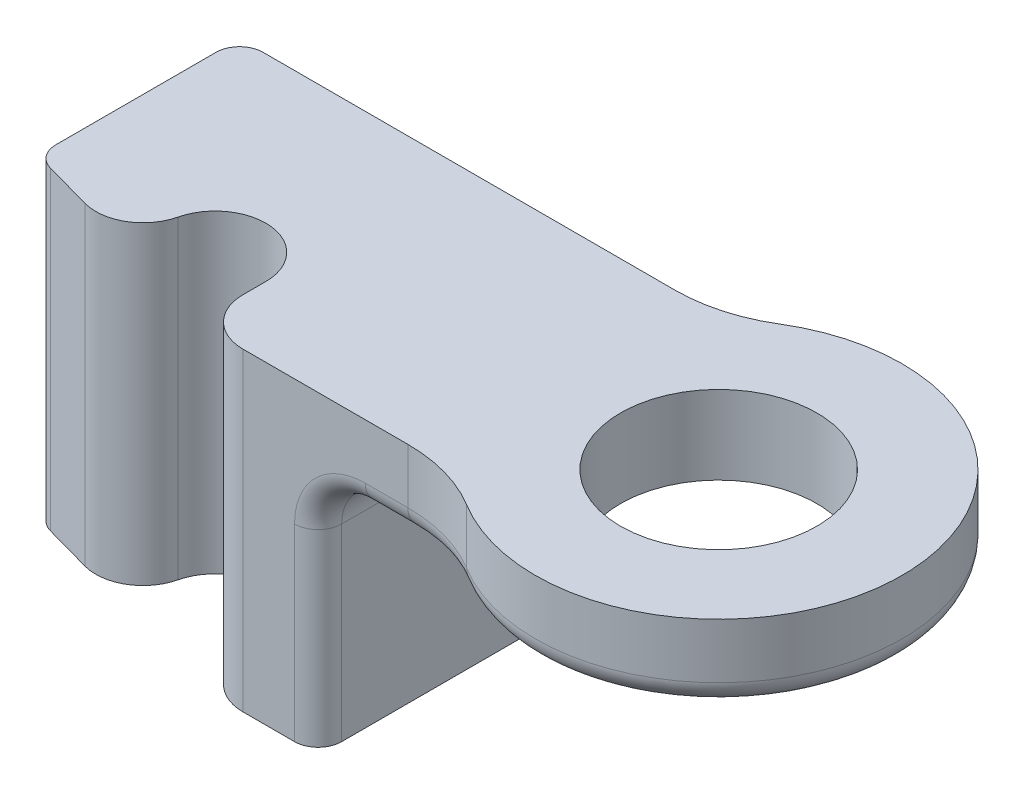
ISO-10303-21;
HEADER;
FILE_DESCRIPTION(('STEP AP214'),'2;1');
FILE_NAME('part.step','',(''),(''),'','','');
FILE_SCHEMA(('AUTOMOTIVE_DESIGN { 1 0 10303 214 1 1 1 1 }'));
ENDSEC;
DATA;
#1=APPLICATION_CONTEXT('core data for automotive mechanical design processes');
#2=APPLICATION_PROTOCOL_DEFINITION('international standard','automotive_design',2000,#1);
#3=PRODUCT_CONTEXT('',#1,'mechanical');
#4=PRODUCT('Part','Part','',(#3));
#5=PRODUCT_RELATED_PRODUCT_CATEGORY('part','',(#4));
#6=PRODUCT_DEFINITION_FORMATION('','',#4);
#7=PRODUCT_DEFINITION_CONTEXT('part definition',#1,'design');
#8=PRODUCT_DEFINITION('design','',#6,#7);
#9=PRODUCT_DEFINITION_SHAPE('','',#8);
#10=(LENGTH_UNIT() NAMED_UNIT(*) SI_UNIT(.MILLI.,.METRE.));
#11=(NAMED_UNIT(*) PLANE_ANGLE_UNIT() SI_UNIT($,.RADIAN.));
#12=(NAMED_UNIT(*) SI_UNIT($,.STERADIAN.) SOLID_ANGLE_UNIT());
#13=UNCERTAINTY_MEASURE_WITH_UNIT(LENGTH_MEASURE(1.E-05),#10,'distance_accuracy_value','');
#14=(GEOMETRIC_REPRESENTATION_CONTEXT(3) GLOBAL_UNCERTAINTY_ASSIGNED_CONTEXT((#13)) GLOBAL_UNIT_ASSIGNED_CONTEXT((#10,
#11,#12)) REPRESENTATION_CONTEXT('',''));
#15=CARTESIAN_POINT('',(0.,0.,0.));
#16=DIRECTION('',(0.,0.,1.));
#17=DIRECTION('',(1.,0.,0.));
#18=AXIS2_PLACEMENT_3D('',#15,#16,#17);
#19=CARTESIAN_POINT('',(0.,40.,0.));
#20=DIRECTION('',(0.,1.,0.));
#21=DIRECTION('',(0.,0.,1.));
#22=AXIS2_PLACEMENT_3D('',#19,#20,#21);
#23=PLANE('',#22);
#24=CARTESIAN_POINT('',(-0.249999999999992,40.,34.2936409579055));
#25=DIRECTION('',(0.,1.,0.));
#26=DIRECTION('',(0.,0.,1.));
#27=AXIS2_PLACEMENT_3D('',#24,#25,#26);
#28=CIRCLE('',#27,6.25);
#29=CARTESIAN_POINT('',(-0.249999999999992,40.,40.5436409579055));
#30=VERTEX_POINT('',#29);
#31=EDGE_CURVE('E193',#30,#30,#28,.T.);
#32=ORIENTED_EDGE('',*,*,#31,.F.);
#33=EDGE_LOOP('',(#32));
#34=FACE_BOUND('',#33,.T.);
#35=DIRECTION('',(0.,0.,1.));
#36=VECTOR('',#35,1.);
#37=CARTESIAN_POINT('',(-25.0293818679506,40.,0.));
#38=LINE('',#37,#36);
#39=CARTESIAN_POINT('',(-25.0293818679506,40.,38.3421713908331));
#40=VERTEX_POINT('',#39);
#41=CARTESIAN_POINT('',(-25.0293818679506,40.,39.7936409579055));
#42=VERTEX_POINT('',#41);
#43=EDGE_CURVE('E189',#40,#42,#38,.T.);
#44=ORIENTED_EDGE('',*,*,#43,.T.);
#45=CARTESIAN_POINT('',(-22.0293818679506,40.,39.7936409579055));
#46=DIRECTION('',(0.,1.,0.));
#47=DIRECTION('',(0.,0.,1.));
#48=AXIS2_PLACEMENT_3D('',#45,#46,#47);
#49=CIRCLE('',#48,3.);
#50=CARTESIAN_POINT('',(-22.0293818679506,40.,42.7936409579055));
#51=VERTEX_POINT('',#50);
#52=EDGE_CURVE('E284',#42,#51,#49,.T.);
#53=ORIENTED_EDGE('',*,*,#52,.T.);
#54=DIRECTION('',(1.,0.,0.));
#55=VECTOR('',#54,1.);
#56=CARTESIAN_POINT('',(0.,40.,42.7936409579055));
#57=LINE('',#56,#55);
#58=CARTESIAN_POINT('',(-11.5394796425068,40.,42.7936409579055));
#59=VERTEX_POINT('',#58);
#60=EDGE_CURVE('E251',#51,#59,#57,.T.);
#61=ORIENTED_EDGE('',*,*,#60,.T.);
#62=CARTESIAN_POINT('',(-11.5394796425068,40.,52.7936409579055));
#63=DIRECTION('',(0.,1.,0.));
#64=DIRECTION('',(0.,0.,1.));
#65=AXIS2_PLACEMENT_3D('',#62,#63,#64);
#66=CIRCLE('',#65,10.);
#67=CARTESIAN_POINT('',(-6.33038128282936,40.,44.2575239086139));
#68=VERTEX_POINT('',#67);
#69=EDGE_CURVE('E298',#59,#68,#66,.F.);
#70=ORIENTED_EDGE('',*,*,#69,.T.);
#71=CARTESIAN_POINT('',(-0.249999999999992,40.,34.2936409579055));
#72=DIRECTION('',(0.,1.,0.));
#73=DIRECTION('',(0.,0.,1.));
#74=AXIS2_PLACEMENT_3D('',#71,#72,#73);
#75=CIRCLE('',#74,11.6726175299288);
#76=CARTESIAN_POINT('',(-6.33038128282937,40.,24.329758007197));
#77=VERTEX_POINT('',#76);
#78=EDGE_CURVE('E216',#68,#77,#75,.T.);
#79=ORIENTED_EDGE('',*,*,#78,.T.);
#80=CARTESIAN_POINT('',(-11.5394796425068,40.,15.7936409579055));
#81=DIRECTION('',(0.,1.,0.));
#82=DIRECTION('',(0.,0.,1.));
#83=AXIS2_PLACEMENT_3D('',#80,#81,#82);
#84=CIRCLE('',#83,10.);
#85=CARTESIAN_POINT('',(-11.5394796425068,40.,25.7936409579055));
#86=VERTEX_POINT('',#85);
#87=EDGE_CURVE('E296',#77,#86,#84,.F.);
#88=ORIENTED_EDGE('',*,*,#87,.T.);
#89=DIRECTION('',(1.,0.,0.));
#90=VECTOR('',#89,1.);
#91=CARTESIAN_POINT('',(0.,40.,25.7936409579055));
#92=LINE('',#91,#90);
#93=CARTESIAN_POINT('',(-37.7500000000002,40.,25.7936409579055));
#94=VERTEX_POINT('',#93);
#95=EDGE_CURVE('E233',#94,#86,#92,.T.);
#96=ORIENTED_EDGE('',*,*,#95,.F.);
#97=CARTESIAN_POINT('',(-37.7500000000002,40.,27.2936409579055));
#98=DIRECTION('',(0.,1.,0.));
#99=DIRECTION('',(0.,0.,1.));
#100=AXIS2_PLACEMENT_3D('',#97,#98,#99);
#101=CIRCLE('',#100,1.5);
#102=CARTESIAN_POINT('',(-39.25,40.,27.2936409579055));
#103=VERTEX_POINT('',#102);
#104=EDGE_CURVE('E224',#94,#103,#101,.T.);
#105=ORIENTED_EDGE('',*,*,#104,.T.);
#106=DIRECTION('',(0.,0.,1.));
#107=VECTOR('',#106,1.);
#108=CARTESIAN_POINT('',(-39.25,40.,0.));
#109=LINE('',#108,#107);
#110=CARTESIAN_POINT('',(-39.25,40.,37.4931462920828));
#111=VERTEX_POINT('',#110);
#112=EDGE_CURVE('E226',#103,#111,#109,.T.);
#113=ORIENTED_EDGE('',*,*,#112,.T.);
#114=CARTESIAN_POINT('',(-37.7500000000003,40.,37.4931462920828));
#115=DIRECTION('',(0.,1.,0.));
#116=DIRECTION('',(0.,0.,1.));
#117=AXIS2_PLACEMENT_3D('',#114,#115,#116);
#118=CIRCLE('',#117,1.5);
#119=CARTESIAN_POINT('',(-38.1508575641177,40.,38.9385919718957));
#120=VERTEX_POINT('',#119);
#121=EDGE_CURVE('E228',#111,#120,#118,.T.);
#122=ORIENTED_EDGE('',*,*,#121,.T.);
#123=DIRECTION('',(0.963630453208622,0.,0.267238376078262));
#124=VECTOR('',#123,1.);
#125=CARTESIAN_POINT('',(-12.752023707663,40.,45.9823119907887));
#126=LINE('',#125,#124);
#127=CARTESIAN_POINT('',(-35.1012787470663,40.,39.784315026909));
#128=VERTEX_POINT('',#127);
#129=EDGE_CURVE('E230',#120,#128,#126,.T.);
#130=ORIENTED_EDGE('',*,*,#129,.T.);
#131=CARTESIAN_POINT('',(-34.2995636188315,40.,36.8934236672832));
#132=DIRECTION('',(0.,1.,0.));
#133=DIRECTION('',(0.,0.,1.));
#134=AXIS2_PLACEMENT_3D('',#131,#132,#133);
#135=CIRCLE('',#134,3.);
#136=CARTESIAN_POINT('',(-31.3820575975263,40.,37.592107154742));
#137=VERTEX_POINT('',#136);
#138=EDGE_CURVE('E250',#128,#137,#135,.T.);
#139=ORIENTED_EDGE('',*,*,#138,.T.);
#140=CARTESIAN_POINT('',(-28.25,40.,38.3421713908331));
#141=DIRECTION('',(0.,1.,0.));
#142=DIRECTION('',(0.,0.,1.));
#143=AXIS2_PLACEMENT_3D('',#140,#141,#142);
#144=CIRCLE('',#143,3.22061813204934);
#145=EDGE_CURVE('E207',#40,#137,#144,.T.);
#146=ORIENTED_EDGE('',*,*,#145,.F.);
#147=EDGE_LOOP('',(#44,#53,#61,#70,#79,#88,#96,#105,#113,#122,#130,#139,#146));
#148=FACE_BOUND('',#147,.T.);
#149=ADVANCED_FACE('F39',(#34,#148),#23,.T.);
#150=CARTESIAN_POINT('',(14.3355111138127,20.,-51.6921831149545));
#151=DIRECTION('',(0.,-1.,0.));
#152=DIRECTION('',(0.,0.,-1.));
#153=AXIS2_PLACEMENT_3D('',#150,#151,#152);
#154=PLANE('',#153);
#155=DIRECTION('',(1.,0.,0.));
#156=VECTOR('',#155,1.);
#157=CARTESIAN_POINT('',(0.,20.,25.7936409579055));
#158=LINE('',#157,#156);
#159=CARTESIAN_POINT('',(-37.7500000000002,20.,25.7936409579055));
#160=VERTEX_POINT('',#159);
#161=CARTESIAN_POINT('',(-18.75,20.,25.7936409579055));
#162=VERTEX_POINT('',#161);
#163=EDGE_CURVE('E219',#160,#162,#158,.T.);
#164=ORIENTED_EDGE('',*,*,#163,.T.);
#165=CARTESIAN_POINT('',(-18.75,20.,27.2936409579055));
#166=DIRECTION('',(0.,-1.,0.));
#167=DIRECTION('',(0.,0.,-1.));
#168=AXIS2_PLACEMENT_3D('',#165,#166,#167);
#169=CIRCLE('',#168,1.5);
#170=CARTESIAN_POINT('',(-17.25,20.,27.2936409579055));
#171=VERTEX_POINT('',#170);
#172=EDGE_CURVE('E309',#162,#171,#169,.T.);
#173=ORIENTED_EDGE('',*,*,#172,.T.);
#174=DIRECTION('',(0.,0.,1.));
#175=VECTOR('',#174,1.);
#176=CARTESIAN_POINT('',(-17.25,20.,0.));
#177=LINE('',#176,#175);
#178=CARTESIAN_POINT('',(-17.25,20.,41.2936409579055));
#179=VERTEX_POINT('',#178);
#180=EDGE_CURVE('E247',#171,#179,#177,.T.);
#181=ORIENTED_EDGE('',*,*,#180,.T.);
#182=CARTESIAN_POINT('',(-18.75,20.,41.2936409579055));
#183=DIRECTION('',(0.,-1.,0.));
#184=DIRECTION('',(0.,0.,-1.));
#185=AXIS2_PLACEMENT_3D('',#182,#183,#184);
#186=CIRCLE('',#185,1.5);
#187=CARTESIAN_POINT('',(-18.75,20.,42.7936409579055));
#188=VERTEX_POINT('',#187);
#189=EDGE_CURVE('E307',#179,#188,#186,.T.);
#190=ORIENTED_EDGE('',*,*,#189,.T.);
#191=DIRECTION('',(-1.,0.,0.));
#192=VECTOR('',#191,1.);
#193=CARTESIAN_POINT('',(-24.25,20.,42.7936409579055));
#194=LINE('',#193,#192);
#195=CARTESIAN_POINT('',(-22.0293818679506,20.,42.7936409579055));
#196=VERTEX_POINT('',#195);
#197=EDGE_CURVE('E220',#188,#196,#194,.T.);
#198=ORIENTED_EDGE('',*,*,#197,.T.);
#199=CARTESIAN_POINT('',(-22.0293818679506,20.,39.7936409579055));
#200=DIRECTION('',(0.,-1.,0.));
#201=DIRECTION('',(0.,0.,-1.));
#202=AXIS2_PLACEMENT_3D('',#199,#200,#201);
#203=CIRCLE('',#202,3.);
#204=CARTESIAN_POINT('',(-25.0293818679506,20.,39.7936409579055));
#205=VERTEX_POINT('',#204);
#206=EDGE_CURVE('E206',#196,#205,#203,.T.);
#207=ORIENTED_EDGE('',*,*,#206,.T.);
#208=DIRECTION('',(0.,0.,1.));
#209=VECTOR('',#208,1.);
#210=CARTESIAN_POINT('',(-25.0293818679506,20.,0.));
#211=LINE('',#210,#209);
#212=CARTESIAN_POINT('',(-25.0293818679506,20.,38.3421713908331));
#213=VERTEX_POINT('',#212);
#214=EDGE_CURVE('E186',#213,#205,#211,.T.);
#215=ORIENTED_EDGE('',*,*,#214,.F.);
#216=CARTESIAN_POINT('',(-28.25,20.,38.3421713908331));
#217=DIRECTION('',(0.,1.,0.));
#218=DIRECTION('',(0.,0.,1.));
#219=AXIS2_PLACEMENT_3D('',#216,#217,#218);
#220=CIRCLE('',#219,3.22061813204934);
#221=CARTESIAN_POINT('',(-31.3820575975263,20.,37.592107154742));
#222=VERTEX_POINT('',#221);
#223=EDGE_CURVE('E194',#213,#222,#220,.T.);
#224=ORIENTED_EDGE('',*,*,#223,.T.);
#225=CARTESIAN_POINT('',(-34.2995636188315,20.,36.8934236672832));
#226=DIRECTION('',(0.,-1.,0.));
#227=DIRECTION('',(0.,0.,-1.));
#228=AXIS2_PLACEMENT_3D('',#225,#226,#227);
#229=CIRCLE('',#228,3.);
#230=CARTESIAN_POINT('',(-35.1012787470663,20.,39.7843150269091));
#231=VERTEX_POINT('',#230);
#232=EDGE_CURVE('E272',#222,#231,#229,.T.);
#233=ORIENTED_EDGE('',*,*,#232,.T.);
#234=DIRECTION('',(0.963630453208622,0.,0.267238376078262));
#235=VECTOR('',#234,1.);
#236=CARTESIAN_POINT('',(-12.752023707663,20.,45.9823119907888));
#237=LINE('',#236,#235);
#238=CARTESIAN_POINT('',(-38.1508575641177,20.,38.9385919718957));
#239=VERTEX_POINT('',#238);
#240=EDGE_CURVE('E223',#239,#231,#237,.T.);
#241=ORIENTED_EDGE('',*,*,#240,.F.);
#242=CARTESIAN_POINT('',(-37.7500000000003,20.,37.4931462920828));
#243=DIRECTION('',(0.,-1.,0.));
#244=DIRECTION('',(0.,0.,-1.));
#245=AXIS2_PLACEMENT_3D('',#242,#243,#244);
#246=CIRCLE('',#245,1.5);
#247=CARTESIAN_POINT('',(-39.2500000000003,20.,37.4931462920828));
#248=VERTEX_POINT('',#247);
#249=EDGE_CURVE('E212',#248,#239,#246,.F.);
#250=ORIENTED_EDGE('',*,*,#249,.F.);
#251=DIRECTION('',(0.,0.,1.));
#252=VECTOR('',#251,1.);
#253=CARTESIAN_POINT('',(-39.25,20.,-38.6337727970078));
#254=LINE('',#253,#252);
#255=CARTESIAN_POINT('',(-39.2500000000002,20.,27.2936409579055));
#256=VERTEX_POINT('',#255);
#257=EDGE_CURVE('E237',#256,#248,#254,.T.);
#258=ORIENTED_EDGE('',*,*,#257,.F.);
#259=CARTESIAN_POINT('',(-37.7500000000002,20.,27.2936409579055));
#260=DIRECTION('',(0.,1.,0.));
#261=DIRECTION('',(0.,0.,1.));
#262=AXIS2_PLACEMENT_3D('',#259,#260,#261);
#263=CIRCLE('',#262,1.5);
#264=EDGE_CURVE('E217',#256,#160,#263,.F.);
#265=ORIENTED_EDGE('',*,*,#264,.T.);
#266=EDGE_LOOP('',(#164,#173,#181,#190,#198,#207,#215,#224,#233,#241,#250,#258,#265));
#267=FACE_BOUND('',#266,.T.);
#268=ADVANCED_FACE('F204',(#267),#154,.T.);
#269=CARTESIAN_POINT('',(-0.249999999999992,-0.00102500000000172,34.2936409579055));
#270=DIRECTION('',(0.,1.,0.));
#271=DIRECTION('',(0.,0.,1.));
#272=AXIS2_PLACEMENT_3D('',#269,#270,#271);
#273=CYLINDRICAL_SURFACE('',#272,6.25);
#274=ORIENTED_EDGE('',*,*,#31,.T.);
#275=EDGE_LOOP('',(#274));
#276=FACE_BOUND('',#275,.T.);
#277=CARTESIAN_POINT('',(-0.249999999999992,35.,34.2936409579055));
#278=DIRECTION('',(0.,1.,0.));
#279=DIRECTION('',(0.,0.,1.));
#280=AXIS2_PLACEMENT_3D('',#277,#278,#279);
#281=CIRCLE('',#280,6.25);
#282=CARTESIAN_POINT('',(-0.249999999999992,35.,40.5436409579055));
#283=VERTEX_POINT('',#282);
#284=EDGE_CURVE('E245',#283,#283,#281,.F.);
#285=ORIENTED_EDGE('',*,*,#284,.T.);
#286=EDGE_LOOP('',(#285));
#287=FACE_BOUND('',#286,.T.);
#288=ADVANCED_FACE('F467',(#276,#287),#273,.F.);
#289=CARTESIAN_POINT('',(-14.25,32.,42.7936409579055));
#290=DIRECTION('',(0.,0.,-1.));
#291=DIRECTION('',(-1.,0.,0.));
#292=AXIS2_PLACEMENT_3D('',#289,#290,#291);
#293=CYLINDRICAL_SURFACE('',#292,3.);
#294=DIRECTION('',(0.,0.,-1.));
#295=VECTOR('',#294,1.);
#296=CARTESIAN_POINT('',(-17.25,32.,0.));
#297=LINE('',#296,#295);
#298=CARTESIAN_POINT('',(-17.25,32.,27.2936409579055));
#299=VERTEX_POINT('',#298);
#300=CARTESIAN_POINT('',(-17.25,32.,41.2936409579055));
#301=VERTEX_POINT('',#300);
#302=EDGE_CURVE('E240',#299,#301,#297,.F.);
#303=ORIENTED_EDGE('',*,*,#302,.F.);
#304=CARTESIAN_POINT('',(-14.25,32.,27.2936409579055));
#305=DIRECTION('',(0.,0.,-1.));
#306=DIRECTION('',(-1.,0.,0.));
#307=AXIS2_PLACEMENT_3D('',#304,#305,#306);
#308=CIRCLE('',#307,3.);
#309=CARTESIAN_POINT('',(-14.25,35.,27.2936409579055));
#310=VERTEX_POINT('',#309);
#311=EDGE_CURVE('E317',#299,#310,#308,.T.);
#312=ORIENTED_EDGE('',*,*,#311,.T.);
#313=DIRECTION('',(0.,0.,-1.));
#314=VECTOR('',#313,1.);
#315=CARTESIAN_POINT('',(-14.25,35.,42.7936409579055));
#316=LINE('',#315,#314);
#317=CARTESIAN_POINT('',(-14.25,35.,41.2936409579055));
#318=VERTEX_POINT('',#317);
#319=EDGE_CURVE('E227',#318,#310,#316,.T.);
#320=ORIENTED_EDGE('',*,*,#319,.F.);
#321=CARTESIAN_POINT('',(-14.25,32.,41.2936409579055));
#322=DIRECTION('',(0.,0.,-1.));
#323=DIRECTION('',(-1.,0.,0.));
#324=AXIS2_PLACEMENT_3D('',#321,#322,#323);
#325=CIRCLE('',#324,3.);
#326=EDGE_CURVE('E315',#318,#301,#325,.F.);
#327=ORIENTED_EDGE('',*,*,#326,.T.);
#328=EDGE_LOOP('',(#303,#312,#320,#327));
#329=FACE_BOUND('',#328,.T.);
#330=ADVANCED_FACE('F387',(#329),#293,.F.);
#331=CARTESIAN_POINT('',(7.75000000000001,35.,42.7936409579055));
#332=DIRECTION('',(0.,1.,0.));
#333=DIRECTION('',(0.,0.,1.));
#334=AXIS2_PLACEMENT_3D('',#331,#332,#333);
#335=PLANE('',#334);
#336=ORIENTED_EDGE('',*,*,#319,.T.);
#337=DIRECTION('',(-1.,0.,0.));
#338=VECTOR('',#337,1.);
#339=CARTESIAN_POINT('',(-11.5394796425068,35.,27.2936409579055));
#340=LINE('',#339,#338);
#341=CARTESIAN_POINT('',(-11.5394796425068,35.,27.2936409579055));
#342=VERTEX_POINT('',#341);
#343=EDGE_CURVE('E327',#310,#342,#340,.F.);
#344=ORIENTED_EDGE('',*,*,#343,.T.);
#345=CARTESIAN_POINT('',(-11.5394796425068,35.,15.7936409579055));
#346=DIRECTION('',(0.,1.,0.));
#347=DIRECTION('',(0.,0.,1.));
#348=AXIS2_PLACEMENT_3D('',#345,#346,#347);
#349=CIRCLE('',#348,11.5);
#350=CARTESIAN_POINT('',(-5.54901652887776,35.,25.6101755645908));
#351=VERTEX_POINT('',#350);
#352=EDGE_CURVE('E325',#342,#351,#349,.T.);
#353=ORIENTED_EDGE('',*,*,#352,.T.);
#354=CARTESIAN_POINT('',(-0.249999999999992,35.,34.2936409579055));
#355=DIRECTION('',(0.,1.,0.));
#356=DIRECTION('',(0.,0.,1.));
#357=AXIS2_PLACEMENT_3D('',#354,#355,#356);
#358=CIRCLE('',#357,10.1726175299288);
#359=CARTESIAN_POINT('',(-5.54901652887774,35.,42.9771063512202));
#360=VERTEX_POINT('',#359);
#361=EDGE_CURVE('E323',#351,#360,#358,.F.);
#362=ORIENTED_EDGE('',*,*,#361,.T.);
#363=CARTESIAN_POINT('',(-11.5394796425068,35.,52.7936409579055));
#364=DIRECTION('',(0.,1.,0.));
#365=DIRECTION('',(0.,0.,1.));
#366=AXIS2_PLACEMENT_3D('',#363,#364,#365);
#367=CIRCLE('',#366,11.5);
#368=CARTESIAN_POINT('',(-11.5394796425068,35.,41.2936409579055));
#369=VERTEX_POINT('',#368);
#370=EDGE_CURVE('E321',#360,#369,#367,.T.);
#371=ORIENTED_EDGE('',*,*,#370,.T.);
#372=DIRECTION('',(-1.,0.,0.));
#373=VECTOR('',#372,1.);
#374=CARTESIAN_POINT('',(7.75000000000001,35.,41.2936409579055));
#375=LINE('',#374,#373);
#376=EDGE_CURVE('E319',#369,#318,#375,.T.);
#377=ORIENTED_EDGE('',*,*,#376,.T.);
#378=EDGE_LOOP('',(#336,#344,#353,#362,#371,#377));
#379=FACE_BOUND('',#378,.T.);
#380=ORIENTED_EDGE('',*,*,#284,.F.);
#381=EDGE_LOOP('',(#380));
#382=FACE_BOUND('',#381,.T.);
#383=ADVANCED_FACE('F390',(#379,#382),#335,.F.);
#384=CARTESIAN_POINT('',(-0.249999999999992,1.98485196156164,34.2936409579055));
#385=DIRECTION('',(0.,1.,0.));
#386=DIRECTION('',(0.,0.,1.));
#387=AXIS2_PLACEMENT_3D('',#384,#385,#386);
#388=CYLINDRICAL_SURFACE('',#387,11.6726175299288);
#389=DIRECTION('',(0.,1.,0.));
#390=VECTOR('',#389,1.);
#391=CARTESIAN_POINT('',(-6.33038128282936,1.98485196156164,44.2575239086139));
#392=LINE('',#391,#390);
#393=CARTESIAN_POINT('',(-6.33038128282936,36.5,44.2575239086139));
#394=VERTEX_POINT('',#393);
#395=EDGE_CURVE('E286',#68,#394,#392,.F.);
#396=ORIENTED_EDGE('',*,*,#395,.T.);
#397=CARTESIAN_POINT('',(-0.249999999999992,36.5,34.2936409579055));
#398=DIRECTION('',(0.,1.,0.));
#399=DIRECTION('',(0.,0.,1.));
#400=AXIS2_PLACEMENT_3D('',#397,#398,#399);
#401=CIRCLE('',#400,11.6726175299288);
#402=CARTESIAN_POINT('',(-6.33038128282937,36.5,24.329758007197));
#403=VERTEX_POINT('',#402);
#404=EDGE_CURVE('E331',#394,#403,#401,.T.);
#405=ORIENTED_EDGE('',*,*,#404,.T.);
#406=DIRECTION('',(0.,1.,0.));
#407=VECTOR('',#406,1.);
#408=CARTESIAN_POINT('',(-6.33038128282937,1.98485196156164,24.329758007197));
#409=LINE('',#408,#407);
#410=EDGE_CURVE('E289',#403,#77,#409,.T.);
#411=ORIENTED_EDGE('',*,*,#410,.T.);
#412=ORIENTED_EDGE('',*,*,#78,.F.);
#413=EDGE_LOOP('',(#396,#405,#411,#412));
#414=FACE_BOUND('',#413,.T.);
#415=ADVANCED_FACE('F450',(#414),#388,.T.);
#416=CARTESIAN_POINT('',(-24.25,20.,42.7936409579055));
#417=DIRECTION('',(0.,0.,-1.));
#418=DIRECTION('',(-1.,0.,0.));
#419=AXIS2_PLACEMENT_3D('',#416,#417,#418);
#420=PLANE('',#419);
#421=CARTESIAN_POINT('',(-14.25,32.,42.7936409579055));
#422=DIRECTION('',(0.,0.,-1.));
#423=DIRECTION('',(-1.,0.,0.));
#424=AXIS2_PLACEMENT_3D('',#421,#422,#423);
#425=CIRCLE('',#424,4.5);
#426=CARTESIAN_POINT('',(-18.75,32.,42.7936409579055));
#427=VERTEX_POINT('',#426);
#428=CARTESIAN_POINT('',(-14.25,36.5,42.7936409579055));
#429=VERTEX_POINT('',#428);
#430=EDGE_CURVE('E48',#427,#429,#425,.T.);
#431=ORIENTED_EDGE('',*,*,#430,.T.);
#432=DIRECTION('',(-1.,0.,0.));
#433=VECTOR('',#432,1.);
#434=CARTESIAN_POINT('',(-24.25,36.5,42.7936409579055));
#435=LINE('',#434,#433);
#436=CARTESIAN_POINT('',(-11.5394796425068,36.5,42.7936409579055));
#437=VERTEX_POINT('',#436);
#438=EDGE_CURVE('E11',#429,#437,#435,.F.);
#439=ORIENTED_EDGE('',*,*,#438,.T.);
#440=DIRECTION('',(0.,1.,0.));
#441=VECTOR('',#440,1.);
#442=CARTESIAN_POINT('',(-11.5394796425068,20.,42.7936409579055));
#443=LINE('',#442,#441);
#444=EDGE_CURVE('E294',#437,#59,#443,.T.);
#445=ORIENTED_EDGE('',*,*,#444,.T.);
#446=ORIENTED_EDGE('',*,*,#60,.F.);
#447=DIRECTION('',(0.,-1.,0.));
#448=VECTOR('',#447,1.);
#449=CARTESIAN_POINT('',(-22.0293818679506,20.,42.7936409579055));
#450=LINE('',#449,#448);
#451=EDGE_CURVE('E278',#51,#196,#450,.T.);
#452=ORIENTED_EDGE('',*,*,#451,.T.);
#453=ORIENTED_EDGE('',*,*,#197,.F.);
#454=DIRECTION('',(0.,-1.,0.));
#455=VECTOR('',#454,1.);
#456=CARTESIAN_POINT('',(-18.75,32.,42.7936409579055));
#457=LINE('',#456,#455);
#458=EDGE_CURVE('E59',#188,#427,#457,.F.);
#459=ORIENTED_EDGE('',*,*,#458,.T.);
#460=EDGE_LOOP('',(#431,#439,#445,#446,#452,#453,#459));
#461=FACE_BOUND('',#460,.T.);
#462=ADVANCED_FACE('F412',(#461),#420,.F.);
#463=CARTESIAN_POINT('',(-37.7500000000003,3.,37.4931462920828));
#464=DIRECTION('',(0.,-1.,0.));
#465=DIRECTION('',(0.,0.,-1.));
#466=AXIS2_PLACEMENT_3D('',#463,#464,#465);
#467=CYLINDRICAL_SURFACE('',#466,1.5);
#468=DIRECTION('',(0.,-1.,0.));
#469=VECTOR('',#468,1.);
#470=CARTESIAN_POINT('',(-39.2500000000003,3.,37.4931462920828));
#471=LINE('',#470,#469);
#472=EDGE_CURVE('E238',#248,#111,#471,.F.);
#473=ORIENTED_EDGE('',*,*,#472,.F.);
#474=ORIENTED_EDGE('',*,*,#249,.T.);
#475=DIRECTION('',(0.,-1.,0.));
#476=VECTOR('',#475,1.);
#477=CARTESIAN_POINT('',(-38.1508575641177,3.,38.9385919718957));
#478=LINE('',#477,#476);
#479=EDGE_CURVE('E215',#120,#239,#478,.T.);
#480=ORIENTED_EDGE('',*,*,#479,.F.);
#481=ORIENTED_EDGE('',*,*,#121,.F.);
#482=EDGE_LOOP('',(#473,#474,#480,#481));
#483=FACE_BOUND('',#482,.T.);
#484=ADVANCED_FACE('F434',(#483),#467,.T.);
#485=CARTESIAN_POINT('',(-39.25,3.,38.6337727970078));
#486=DIRECTION('',(-0.267238376078262,0.,0.963630453208622));
#487=DIRECTION('',(0.963630453208622,0.,0.267238376078262));
#488=AXIS2_PLACEMENT_3D('',#485,#486,#487);
#489=PLANE('',#488);
#490=ORIENTED_EDGE('',*,*,#240,.T.);
#491=DIRECTION('',(0.,-1.,0.));
#492=VECTOR('',#491,1.);
#493=CARTESIAN_POINT('',(-35.1012787470663,40.,39.784315026909));
#494=LINE('',#493,#492);
#495=EDGE_CURVE('E274',#231,#128,#494,.F.);
#496=ORIENTED_EDGE('',*,*,#495,.T.);
#497=ORIENTED_EDGE('',*,*,#129,.F.);
#498=ORIENTED_EDGE('',*,*,#479,.T.);
#499=EDGE_LOOP('',(#490,#496,#497,#498));
#500=FACE_BOUND('',#499,.T.);
#501=ADVANCED_FACE('F428',(#500),#489,.T.);
#502=CARTESIAN_POINT('',(-37.7500000000002,3.,27.2936409579055));
#503=DIRECTION('',(0.,-1.,0.));
#504=DIRECTION('',(0.,0.,-1.));
#505=AXIS2_PLACEMENT_3D('',#502,#503,#504);
#506=CYLINDRICAL_SURFACE('',#505,1.5);
#507=ORIENTED_EDGE('',*,*,#104,.F.);
#508=DIRECTION('',(0.,-1.,0.));
#509=VECTOR('',#508,1.);
#510=CARTESIAN_POINT('',(-37.7500000000002,40.,25.7936409579055));
#511=LINE('',#510,#509);
#512=EDGE_CURVE('E231',#160,#94,#511,.F.);
#513=ORIENTED_EDGE('',*,*,#512,.F.);
#514=ORIENTED_EDGE('',*,*,#264,.F.);
#515=DIRECTION('',(0.,-1.,0.));
#516=VECTOR('',#515,1.);
#517=CARTESIAN_POINT('',(-39.2500000000002,3.,27.2936409579055));
#518=LINE('',#517,#516);
#519=EDGE_CURVE('E234',#103,#256,#518,.T.);
#520=ORIENTED_EDGE('',*,*,#519,.F.);
#521=EDGE_LOOP('',(#507,#513,#514,#520));
#522=FACE_BOUND('',#521,.T.);
#523=ADVANCED_FACE('F442',(#522),#506,.T.);
#524=CARTESIAN_POINT('',(0.,40.,25.7936409579055));
#525=DIRECTION('',(0.,0.,-1.));
#526=DIRECTION('',(-1.,0.,0.));
#527=AXIS2_PLACEMENT_3D('',#524,#525,#526);
#528=PLANE('',#527);
#529=CARTESIAN_POINT('',(-14.25,32.,25.7936409579055));
#530=DIRECTION('',(0.,0.,-1.));
#531=DIRECTION('',(-1.,0.,0.));
#532=AXIS2_PLACEMENT_3D('',#529,#530,#531);
#533=CIRCLE('',#532,4.5);
#534=CARTESIAN_POINT('',(-14.25,36.5,25.7936409579055));
#535=VERTEX_POINT('',#534);
#536=CARTESIAN_POINT('',(-18.75,32.,25.7936409579055));
#537=VERTEX_POINT('',#536);
#538=EDGE_CURVE('E302',#535,#537,#533,.F.);
#539=ORIENTED_EDGE('',*,*,#538,.T.);
#540=DIRECTION('',(0.,-1.,0.));
#541=VECTOR('',#540,1.);
#542=CARTESIAN_POINT('',(-18.75,40.,25.7936409579055));
#543=LINE('',#542,#541);
#544=EDGE_CURVE('E304',#537,#162,#543,.T.);
#545=ORIENTED_EDGE('',*,*,#544,.T.);
#546=ORIENTED_EDGE('',*,*,#163,.F.);
#547=ORIENTED_EDGE('',*,*,#512,.T.);
#548=ORIENTED_EDGE('',*,*,#95,.T.);
#549=DIRECTION('',(0.,-1.,0.));
#550=VECTOR('',#549,1.);
#551=CARTESIAN_POINT('',(-11.5394796425068,35.,25.7936409579055));
#552=LINE('',#551,#550);
#553=CARTESIAN_POINT('',(-11.5394796425068,36.5,25.7936409579055));
#554=VERTEX_POINT('',#553);
#555=EDGE_CURVE('E291',#86,#554,#552,.T.);
#556=ORIENTED_EDGE('',*,*,#555,.T.);
#557=DIRECTION('',(-1.,0.,0.));
#558=VECTOR('',#557,1.);
#559=CARTESIAN_POINT('',(-14.25,36.5,25.7936409579055));
#560=LINE('',#559,#558);
#561=EDGE_CURVE('E300',#554,#535,#560,.T.);
#562=ORIENTED_EDGE('',*,*,#561,.T.);
#563=EDGE_LOOP('',(#539,#545,#546,#547,#548,#556,#562));
#564=FACE_BOUND('',#563,.T.);
#565=ADVANCED_FACE('F376',(#564),#528,.T.);
#566=CARTESIAN_POINT('',(-39.25,3.,-38.6337727970078));
#567=DIRECTION('',(-1.,0.,0.));
#568=DIRECTION('',(0.,0.,1.));
#569=AXIS2_PLACEMENT_3D('',#566,#567,#568);
#570=PLANE('',#569);
#571=ORIENTED_EDGE('',*,*,#519,.T.);
#572=ORIENTED_EDGE('',*,*,#257,.T.);
#573=ORIENTED_EDGE('',*,*,#472,.T.);
#574=ORIENTED_EDGE('',*,*,#112,.F.);
#575=EDGE_LOOP('',(#571,#572,#573,#574));
#576=FACE_BOUND('',#575,.T.);
#577=ADVANCED_FACE('F437',(#576),#570,.T.);
#578=CARTESIAN_POINT('',(-17.25,40.,0.));
#579=DIRECTION('',(1.,0.,0.));
#580=DIRECTION('',(0.,0.,-1.));
#581=AXIS2_PLACEMENT_3D('',#578,#579,#580);
#582=PLANE('',#581);
#583=ORIENTED_EDGE('',*,*,#180,.F.);
#584=DIRECTION('',(0.,-1.,0.));
#585=VECTOR('',#584,1.);
#586=CARTESIAN_POINT('',(-17.25,40.,27.2936409579055));
#587=LINE('',#586,#585);
#588=EDGE_CURVE('E313',#171,#299,#587,.F.);
#589=ORIENTED_EDGE('',*,*,#588,.T.);
#590=ORIENTED_EDGE('',*,*,#302,.T.);
#591=DIRECTION('',(0.,-1.,0.));
#592=VECTOR('',#591,1.);
#593=CARTESIAN_POINT('',(-17.25,20.,41.2936409579055));
#594=LINE('',#593,#592);
#595=EDGE_CURVE('E311',#301,#179,#594,.T.);
#596=ORIENTED_EDGE('',*,*,#595,.T.);
#597=EDGE_LOOP('',(#583,#589,#590,#596));
#598=FACE_BOUND('',#597,.T.);
#599=ADVANCED_FACE('F368',(#598),#582,.T.);
#600=CARTESIAN_POINT('',(-25.0293818679506,20.,0.));
#601=DIRECTION('',(-1.,0.,0.));
#602=DIRECTION('',(0.,0.,1.));
#603=AXIS2_PLACEMENT_3D('',#600,#601,#602);
#604=PLANE('',#603);
#605=ORIENTED_EDGE('',*,*,#214,.T.);
#606=DIRECTION('',(0.,-1.,0.));
#607=VECTOR('',#606,1.);
#608=CARTESIAN_POINT('',(-25.0293818679506,20.,39.7936409579055));
#609=LINE('',#608,#607);
#610=EDGE_CURVE('E282',#205,#42,#609,.F.);
#611=ORIENTED_EDGE('',*,*,#610,.T.);
#612=ORIENTED_EDGE('',*,*,#43,.F.);
#613=DIRECTION('',(0.,1.,0.));
#614=VECTOR('',#613,1.);
#615=CARTESIAN_POINT('',(-25.0293818679506,20.,38.3421713908331));
#616=LINE('',#615,#614);
#617=EDGE_CURVE('E182',#213,#40,#616,.T.);
#618=ORIENTED_EDGE('',*,*,#617,.F.);
#619=EDGE_LOOP('',(#605,#611,#612,#618));
#620=FACE_BOUND('',#619,.T.);
#621=ADVANCED_FACE('F184',(#620),#604,.T.);
#622=CARTESIAN_POINT('',(-28.25,20.,38.3421713908331));
#623=DIRECTION('',(0.,1.,0.));
#624=DIRECTION('',(0.,0.,1.));
#625=AXIS2_PLACEMENT_3D('',#622,#623,#624);
#626=CYLINDRICAL_SURFACE('',#625,3.22061813204934);
#627=ORIENTED_EDGE('',*,*,#145,.T.);
#628=DIRECTION('',(0.,1.,0.));
#629=VECTOR('',#628,1.);
#630=CARTESIAN_POINT('',(-31.3820575975263,20.,37.592107154742));
#631=LINE('',#630,#629);
#632=EDGE_CURVE('E199',#137,#222,#631,.F.);
#633=ORIENTED_EDGE('',*,*,#632,.T.);
#634=ORIENTED_EDGE('',*,*,#223,.F.);
#635=ORIENTED_EDGE('',*,*,#617,.T.);
#636=EDGE_LOOP('',(#627,#633,#634,#635));
#637=FACE_BOUND('',#636,.T.);
#638=ADVANCED_FACE('F197',(#637),#626,.F.);
#639=CARTESIAN_POINT('',(-34.2995636188315,20.,36.8934236672832));
#640=DIRECTION('',(0.,1.,0.));
#641=DIRECTION('',(0.,0.,1.));
#642=AXIS2_PLACEMENT_3D('',#639,#640,#641);
#643=CYLINDRICAL_SURFACE('',#642,3.);
#644=ORIENTED_EDGE('',*,*,#232,.F.);
#645=ORIENTED_EDGE('',*,*,#632,.F.);
#646=ORIENTED_EDGE('',*,*,#138,.F.);
#647=ORIENTED_EDGE('',*,*,#495,.F.);
#648=EDGE_LOOP('',(#644,#645,#646,#647));
#649=FACE_BOUND('',#648,.T.);
#650=ADVANCED_FACE('F425',(#649),#643,.T.);
#651=CARTESIAN_POINT('',(-22.0293818679506,20.,39.7936409579055));
#652=DIRECTION('',(0.,1.,0.));
#653=DIRECTION('',(0.,0.,1.));
#654=AXIS2_PLACEMENT_3D('',#651,#652,#653);
#655=CYLINDRICAL_SURFACE('',#654,3.);
#656=ORIENTED_EDGE('',*,*,#52,.F.);
#657=ORIENTED_EDGE('',*,*,#610,.F.);
#658=ORIENTED_EDGE('',*,*,#206,.F.);
#659=ORIENTED_EDGE('',*,*,#451,.F.);
#660=EDGE_LOOP('',(#656,#657,#658,#659));
#661=FACE_BOUND('',#660,.T.);
#662=ADVANCED_FACE('F423',(#661),#655,.T.);
#663=CARTESIAN_POINT('',(-11.5394796425068,1.98485196156164,15.7936409579055));
#664=DIRECTION('',(0.,1.,0.));
#665=DIRECTION('',(0.,0.,1.));
#666=AXIS2_PLACEMENT_3D('',#663,#664,#665);
#667=CYLINDRICAL_SURFACE('',#666,10.);
#668=ORIENTED_EDGE('',*,*,#410,.F.);
#669=CARTESIAN_POINT('',(-11.5394796425068,36.5,15.7936409579055));
#670=DIRECTION('',(0.,1.,0.));
#671=DIRECTION('',(0.,0.,1.));
#672=AXIS2_PLACEMENT_3D('',#669,#670,#671);
#673=CIRCLE('',#672,10.);
#674=EDGE_CURVE('E329',#403,#554,#673,.F.);
#675=ORIENTED_EDGE('',*,*,#674,.T.);
#676=ORIENTED_EDGE('',*,*,#555,.F.);
#677=ORIENTED_EDGE('',*,*,#87,.F.);
#678=EDGE_LOOP('',(#668,#675,#676,#677));
#679=FACE_BOUND('',#678,.T.);
#680=ADVANCED_FACE('F448',(#679),#667,.F.);
#681=CARTESIAN_POINT('',(-11.5394796425068,1.98485196156164,52.7936409579055));
#682=DIRECTION('',(0.,1.,0.));
#683=DIRECTION('',(0.,0.,1.));
#684=AXIS2_PLACEMENT_3D('',#681,#682,#683);
#685=CYLINDRICAL_SURFACE('',#684,10.);
#686=ORIENTED_EDGE('',*,*,#444,.F.);
#687=CARTESIAN_POINT('',(-11.5394796425068,36.5,52.7936409579055));
#688=DIRECTION('',(0.,1.,0.));
#689=DIRECTION('',(0.,0.,1.));
#690=AXIS2_PLACEMENT_3D('',#687,#688,#689);
#691=CIRCLE('',#690,10.);
#692=EDGE_CURVE('E333',#437,#394,#691,.F.);
#693=ORIENTED_EDGE('',*,*,#692,.T.);
#694=ORIENTED_EDGE('',*,*,#395,.F.);
#695=ORIENTED_EDGE('',*,*,#69,.F.);
#696=EDGE_LOOP('',(#686,#693,#694,#695));
#697=FACE_BOUND('',#696,.T.);
#698=ADVANCED_FACE('F416',(#697),#685,.F.);
#699=CARTESIAN_POINT('',(-18.75,40.,41.2936409579055));
#700=DIRECTION('',(0.,1.,0.));
#701=DIRECTION('',(0.,0.,1.));
#702=AXIS2_PLACEMENT_3D('',#699,#700,#701);
#703=CYLINDRICAL_SURFACE('',#702,1.5);
#704=ORIENTED_EDGE('',*,*,#189,.F.);
#705=ORIENTED_EDGE('',*,*,#595,.F.);
#706=CARTESIAN_POINT('',(-18.75,32.,41.2936409579055));
#707=DIRECTION('',(0.,1.,0.));
#708=DIRECTION('',(0.,0.,1.));
#709=AXIS2_PLACEMENT_3D('',#706,#707,#708);
#710=CIRCLE('',#709,1.5);
#711=EDGE_CURVE('E43',#427,#301,#710,.T.);
#712=ORIENTED_EDGE('',*,*,#711,.F.);
#713=ORIENTED_EDGE('',*,*,#458,.F.);
#714=EDGE_LOOP('',(#704,#705,#712,#713));
#715=FACE_BOUND('',#714,.T.);
#716=ADVANCED_FACE('F41',(#715),#703,.T.);
#717=CARTESIAN_POINT('',(-14.25,32.,41.2936409579055));
#718=DIRECTION('',(0.,0.,-1.));
#719=DIRECTION('',(-1.,0.,0.));
#720=AXIS2_PLACEMENT_3D('',#717,#718,#719);
#721=TOROIDAL_SURFACE('',#720,4.5,1.5);
#722=ORIENTED_EDGE('',*,*,#711,.T.);
#723=ORIENTED_EDGE('',*,*,#326,.F.);
#724=CARTESIAN_POINT('',(-14.25,36.5,41.2936409579055));
#725=DIRECTION('',(1.,0.,0.));
#726=DIRECTION('',(0.,0.,-1.));
#727=AXIS2_PLACEMENT_3D('',#724,#725,#726);
#728=CIRCLE('',#727,1.5);
#729=EDGE_CURVE('E354',#429,#318,#728,.T.);
#730=ORIENTED_EDGE('',*,*,#729,.F.);
#731=ORIENTED_EDGE('',*,*,#430,.F.);
#732=EDGE_LOOP('',(#722,#723,#730,#731));
#733=FACE_BOUND('',#732,.T.);
#734=ADVANCED_FACE('F362',(#733),#721,.T.);
#735=CARTESIAN_POINT('',(7.75000000000001,36.5,41.2936409579055));
#736=DIRECTION('',(-1.,0.,0.));
#737=DIRECTION('',(0.,0.,1.));
#738=AXIS2_PLACEMENT_3D('',#735,#736,#737);
#739=CYLINDRICAL_SURFACE('',#738,1.5);
#740=ORIENTED_EDGE('',*,*,#729,.T.);
#741=ORIENTED_EDGE('',*,*,#376,.F.);
#742=CARTESIAN_POINT('',(-11.5394796425068,36.5,41.2936409579055));
#743=DIRECTION('',(1.,0.,0.));
#744=DIRECTION('',(0.,0.,-1.));
#745=AXIS2_PLACEMENT_3D('',#742,#743,#744);
#746=CIRCLE('',#745,1.5);
#747=EDGE_CURVE('E352',#437,#369,#746,.T.);
#748=ORIENTED_EDGE('',*,*,#747,.F.);
#749=ORIENTED_EDGE('',*,*,#438,.F.);
#750=EDGE_LOOP('',(#740,#741,#748,#749));
#751=FACE_BOUND('',#750,.T.);
#752=ADVANCED_FACE('F410',(#751),#739,.T.);
#753=CARTESIAN_POINT('',(-11.5394796425068,36.5,52.7936409579055));
#754=DIRECTION('',(0.,1.,0.));
#755=DIRECTION('',(0.,0.,1.));
#756=AXIS2_PLACEMENT_3D('',#753,#754,#755);
#757=TOROIDAL_SURFACE('',#756,11.5,1.5);
#758=ORIENTED_EDGE('',*,*,#747,.T.);
#759=ORIENTED_EDGE('',*,*,#370,.F.);
#760=CARTESIAN_POINT('',(-5.54901652887775,36.5,42.9771063512202));
#761=DIRECTION('',(0.853611704929157,0.,0.520909835967741));
#762=DIRECTION('',(0.520909835967741,0.,-0.853611704929157));
#763=AXIS2_PLACEMENT_3D('',#760,#761,#762);
#764=CIRCLE('',#763,1.5);
#765=EDGE_CURVE('E349',#394,#360,#764,.T.);
#766=ORIENTED_EDGE('',*,*,#765,.F.);
#767=ORIENTED_EDGE('',*,*,#692,.F.);
#768=EDGE_LOOP('',(#758,#759,#766,#767));
#769=FACE_BOUND('',#768,.T.);
#770=ADVANCED_FACE('F408',(#769),#757,.T.);
#771=CARTESIAN_POINT('',(-0.249999999999992,36.5,34.2936409579055));
#772=DIRECTION('',(0.,1.,0.));
#773=DIRECTION('',(0.,0.,1.));
#774=AXIS2_PLACEMENT_3D('',#771,#772,#773);
#775=TOROIDAL_SURFACE('',#774,10.1726175299288,1.5);
#776=ORIENTED_EDGE('',*,*,#765,.T.);
#777=ORIENTED_EDGE('',*,*,#361,.F.);
#778=CARTESIAN_POINT('',(-5.54901652887776,36.5,25.6101755645908));
#779=DIRECTION('',(-0.853611704929156,0.,0.520909835967742));
#780=DIRECTION('',(0.520909835967742,0.,0.853611704929156));
#781=AXIS2_PLACEMENT_3D('',#778,#779,#780);
#782=CIRCLE('',#781,1.5);
#783=EDGE_CURVE('E346',#403,#351,#782,.T.);
#784=ORIENTED_EDGE('',*,*,#783,.F.);
#785=ORIENTED_EDGE('',*,*,#404,.F.);
#786=EDGE_LOOP('',(#776,#777,#784,#785));
#787=FACE_BOUND('',#786,.T.);
#788=ADVANCED_FACE('F403',(#787),#775,.T.);
#789=CARTESIAN_POINT('',(-11.5394796425068,36.5,15.7936409579055));
#790=DIRECTION('',(0.,1.,0.));
#791=DIRECTION('',(0.,0.,1.));
#792=AXIS2_PLACEMENT_3D('',#789,#790,#791);
#793=TOROIDAL_SURFACE('',#792,11.5,1.5);
#794=ORIENTED_EDGE('',*,*,#783,.T.);
#795=ORIENTED_EDGE('',*,*,#352,.F.);
#796=CARTESIAN_POINT('',(-11.5394796425068,36.5,27.2936409579055));
#797=DIRECTION('',(-1.,0.,0.));
#798=DIRECTION('',(0.,0.,1.));
#799=AXIS2_PLACEMENT_3D('',#796,#797,#798);
#800=CIRCLE('',#799,1.5);
#801=EDGE_CURVE('E343',#554,#342,#800,.T.);
#802=ORIENTED_EDGE('',*,*,#801,.F.);
#803=ORIENTED_EDGE('',*,*,#674,.F.);
#804=EDGE_LOOP('',(#794,#795,#802,#803));
#805=FACE_BOUND('',#804,.T.);
#806=ADVANCED_FACE('F398',(#805),#793,.T.);
#807=CARTESIAN_POINT('',(0.,36.5,27.2936409579055));
#808=DIRECTION('',(1.,0.,0.));
#809=DIRECTION('',(0.,0.,-1.));
#810=AXIS2_PLACEMENT_3D('',#807,#808,#809);
#811=CYLINDRICAL_SURFACE('',#810,1.5);
#812=ORIENTED_EDGE('',*,*,#801,.T.);
#813=ORIENTED_EDGE('',*,*,#343,.F.);
#814=CARTESIAN_POINT('',(-14.25,36.5,27.2936409579055));
#815=DIRECTION('',(-1.,0.,0.));
#816=DIRECTION('',(0.,0.,1.));
#817=AXIS2_PLACEMENT_3D('',#814,#815,#816);
#818=CIRCLE('',#817,1.5);
#819=EDGE_CURVE('E340',#535,#310,#818,.T.);
#820=ORIENTED_EDGE('',*,*,#819,.F.);
#821=ORIENTED_EDGE('',*,*,#561,.F.);
#822=EDGE_LOOP('',(#812,#813,#820,#821));
#823=FACE_BOUND('',#822,.T.);
#824=ADVANCED_FACE('F394',(#823),#811,.T.);
#825=CARTESIAN_POINT('',(-14.25,32.,27.2936409579055));
#826=DIRECTION('',(0.,0.,-1.));
#827=DIRECTION('',(-1.,0.,0.));
#828=AXIS2_PLACEMENT_3D('',#825,#826,#827);
#829=TOROIDAL_SURFACE('',#828,4.5,1.5);
#830=ORIENTED_EDGE('',*,*,#819,.T.);
#831=ORIENTED_EDGE('',*,*,#311,.F.);
#832=CARTESIAN_POINT('',(-18.75,32.,27.2936409579055));
#833=DIRECTION('',(0.,-1.,0.));
#834=DIRECTION('',(0.,0.,-1.));
#835=AXIS2_PLACEMENT_3D('',#832,#833,#834);
#836=CIRCLE('',#835,1.5);
#837=EDGE_CURVE('E337',#537,#299,#836,.T.);
#838=ORIENTED_EDGE('',*,*,#837,.F.);
#839=ORIENTED_EDGE('',*,*,#538,.F.);
#840=EDGE_LOOP('',(#830,#831,#838,#839));
#841=FACE_BOUND('',#840,.T.);
#842=ADVANCED_FACE('F384',(#841),#829,.T.);
#843=CARTESIAN_POINT('',(-18.75,40.,27.2936409579055));
#844=DIRECTION('',(0.,-1.,0.));
#845=DIRECTION('',(0.,0.,-1.));
#846=AXIS2_PLACEMENT_3D('',#843,#844,#845);
#847=CYLINDRICAL_SURFACE('',#846,1.5);
#848=ORIENTED_EDGE('',*,*,#837,.T.);
#849=ORIENTED_EDGE('',*,*,#588,.F.);
#850=ORIENTED_EDGE('',*,*,#172,.F.);
#851=ORIENTED_EDGE('',*,*,#544,.F.);
#852=EDGE_LOOP('',(#848,#849,#850,#851));
#853=FACE_BOUND('',#852,.T.);
#854=ADVANCED_FACE('F374',(#853),#847,.T.);
#855=CLOSED_SHELL('',(#149,#268,#288,#330,#383,#415,#462,#484,#501,#523,#565,#577,#599,#621,
#638,#650,#662,#680,#698,#716,#734,#752,#770,#788,#806,#824,#842,#854));
#856=MANIFOLD_SOLID_BREP('B2',#855);
#857=ADVANCED_BREP_SHAPE_REPRESENTATION('',(#18,#856),#14);
#858=SHAPE_DEFINITION_REPRESENTATION(#9,#857);
ENDSEC;
END-ISO-10303-21;
